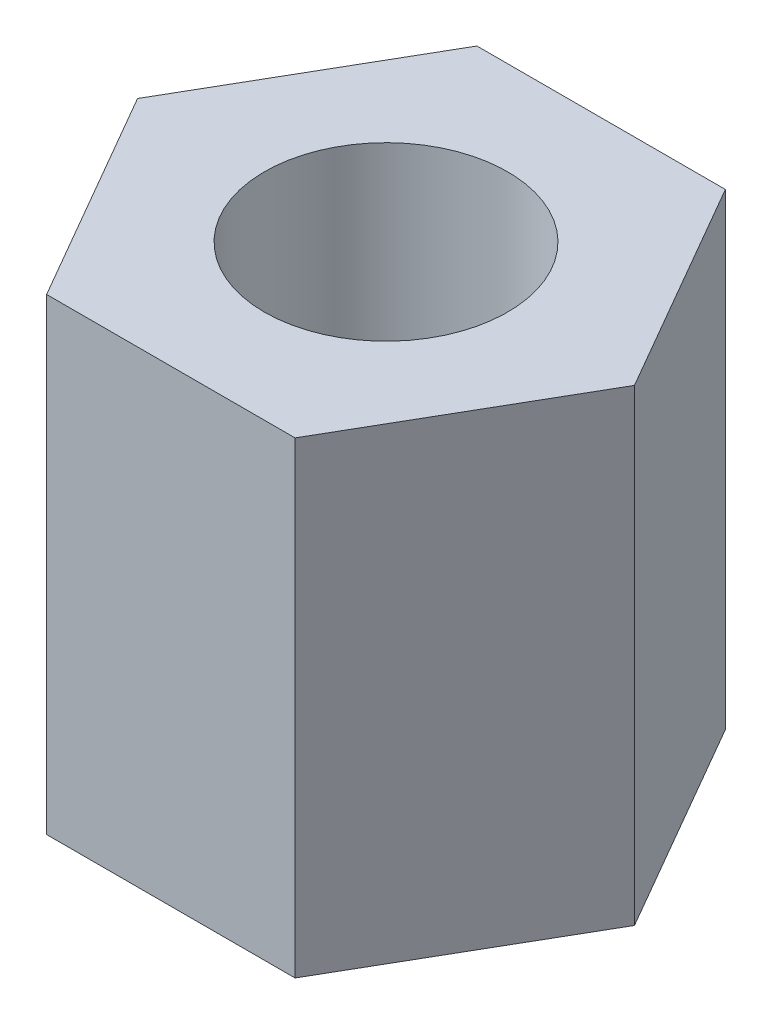
ISO-10303-21;
HEADER;
FILE_DESCRIPTION(('STEP AP214'),'2;1');
FILE_NAME('part.step','',(''),(''),'','','');
FILE_SCHEMA(('AUTOMOTIVE_DESIGN { 1 0 10303 214 1 1 1 1 }'));
ENDSEC;
DATA;
#1=APPLICATION_CONTEXT('core data for automotive mechanical design processes');
#2=APPLICATION_PROTOCOL_DEFINITION('international standard','automotive_design',2000,#1);
#3=PRODUCT_CONTEXT('',#1,'mechanical');
#4=PRODUCT('Part','Part','',(#3));
#5=PRODUCT_RELATED_PRODUCT_CATEGORY('part','',(#4));
#6=PRODUCT_DEFINITION_FORMATION('','',#4);
#7=PRODUCT_DEFINITION_CONTEXT('part definition',#1,'design');
#8=PRODUCT_DEFINITION('design','',#6,#7);
#9=PRODUCT_DEFINITION_SHAPE('','',#8);
#10=(LENGTH_UNIT() NAMED_UNIT(*) SI_UNIT(.MILLI.,.METRE.));
#11=(NAMED_UNIT(*) PLANE_ANGLE_UNIT() SI_UNIT($,.RADIAN.));
#12=(NAMED_UNIT(*) SI_UNIT($,.STERADIAN.) SOLID_ANGLE_UNIT());
#13=UNCERTAINTY_MEASURE_WITH_UNIT(LENGTH_MEASURE(1.E-05),#10,'distance_accuracy_value','');
#14=(GEOMETRIC_REPRESENTATION_CONTEXT(3) GLOBAL_UNCERTAINTY_ASSIGNED_CONTEXT((#13)) GLOBAL_UNIT_ASSIGNED_CONTEXT((#10,
#11,#12)) REPRESENTATION_CONTEXT('',''));
#15=CARTESIAN_POINT('',(0.,0.,0.));
#16=DIRECTION('',(0.,0.,1.));
#17=DIRECTION('',(1.,0.,0.));
#18=AXIS2_PLACEMENT_3D('',#15,#16,#17);
#19=CARTESIAN_POINT('',(0.,5.,0.));
#20=DIRECTION('',(0.,1.,0.));
#21=DIRECTION('',(0.,0.,1.));
#22=AXIS2_PLACEMENT_3D('',#19,#20,#21);
#23=PLANE('',#22);
#24=DIRECTION('',(1.,0.,0.));
#25=VECTOR('',#24,1.);
#26=CARTESIAN_POINT('',(-1.32790561913614,5.,2.3));
#27=LINE('',#26,#25);
#28=CARTESIAN_POINT('',(-1.32790561913614,5.,2.3));
#29=VERTEX_POINT('',#28);
#30=CARTESIAN_POINT('',(1.32790561913614,5.,2.3));
#31=VERTEX_POINT('',#30);
#32=EDGE_CURVE('E134',#29,#31,#27,.T.);
#33=ORIENTED_EDGE('',*,*,#32,.T.);
#34=DIRECTION('',(0.5,0.,-0.866025403784439));
#35=VECTOR('',#34,1.);
#36=CARTESIAN_POINT('',(1.32790561913614,5.,2.3));
#37=LINE('',#36,#35);
#38=CARTESIAN_POINT('',(2.65581123827228,5.,0.));
#39=VERTEX_POINT('',#38);
#40=EDGE_CURVE('E93',#31,#39,#37,.T.);
#41=ORIENTED_EDGE('',*,*,#40,.T.);
#42=DIRECTION('',(-0.5,0.,-0.866025403784438));
#43=VECTOR('',#42,1.);
#44=CARTESIAN_POINT('',(2.65581123827228,5.,0.));
#45=LINE('',#44,#43);
#46=CARTESIAN_POINT('',(1.32790561913614,5.,-2.3));
#47=VERTEX_POINT('',#46);
#48=EDGE_CURVE('E107',#39,#47,#45,.T.);
#49=ORIENTED_EDGE('',*,*,#48,.T.);
#50=DIRECTION('',(-1.,0.,0.));
#51=VECTOR('',#50,1.);
#52=CARTESIAN_POINT('',(1.32790561913614,5.,-2.3));
#53=LINE('',#52,#51);
#54=CARTESIAN_POINT('',(-1.32790561913614,5.,-2.3));
#55=VERTEX_POINT('',#54);
#56=EDGE_CURVE('E99',#47,#55,#53,.T.);
#57=ORIENTED_EDGE('',*,*,#56,.T.);
#58=DIRECTION('',(-0.5,0.,0.866025403784439));
#59=VECTOR('',#58,1.);
#60=CARTESIAN_POINT('',(-1.32790561913614,5.,-2.3));
#61=LINE('',#60,#59);
#62=CARTESIAN_POINT('',(-2.65581123827228,5.,0.));
#63=VERTEX_POINT('',#62);
#64=EDGE_CURVE('E101',#55,#63,#61,.T.);
#65=ORIENTED_EDGE('',*,*,#64,.T.);
#66=DIRECTION('',(0.5,0.,0.866025403784439));
#67=VECTOR('',#66,1.);
#68=CARTESIAN_POINT('',(-2.65581123827228,5.,0.));
#69=LINE('',#68,#67);
#70=EDGE_CURVE('E57',#63,#29,#69,.T.);
#71=ORIENTED_EDGE('',*,*,#70,.T.);
#72=EDGE_LOOP('',(#33,#41,#49,#57,#65,#71));
#73=FACE_BOUND('',#72,.T.);
#74=CARTESIAN_POINT('',(0.,5.,0.));
#75=DIRECTION('',(0.,1.,0.));
#76=DIRECTION('',(0.,0.,1.));
#77=AXIS2_PLACEMENT_3D('',#74,#75,#76);
#78=CIRCLE('',#77,1.3);
#79=CARTESIAN_POINT('',(0.,5.,1.3));
#80=VERTEX_POINT('',#79);
#81=EDGE_CURVE('E126',#80,#80,#78,.T.);
#82=ORIENTED_EDGE('',*,*,#81,.F.);
#83=EDGE_LOOP('',(#82));
#84=FACE_BOUND('',#83,.T.);
#85=ADVANCED_FACE('F39',(#73,#84),#23,.T.);
#86=CARTESIAN_POINT('',(0.,0.,0.));
#87=DIRECTION('',(0.,1.,0.));
#88=DIRECTION('',(0.,0.,1.));
#89=AXIS2_PLACEMENT_3D('',#86,#87,#88);
#90=PLANE('',#89);
#91=DIRECTION('',(1.,0.,0.));
#92=VECTOR('',#91,1.);
#93=CARTESIAN_POINT('',(-1.32790561913614,0.,2.3));
#94=LINE('',#93,#92);
#95=CARTESIAN_POINT('',(-1.32790561913614,0.,2.3));
#96=VERTEX_POINT('',#95);
#97=CARTESIAN_POINT('',(1.32790561913614,0.,2.3));
#98=VERTEX_POINT('',#97);
#99=EDGE_CURVE('E125',#96,#98,#94,.T.);
#100=ORIENTED_EDGE('',*,*,#99,.F.);
#101=DIRECTION('',(0.5,0.,0.866025403784439));
#102=VECTOR('',#101,1.);
#103=CARTESIAN_POINT('',(-2.65581123827228,0.,0.));
#104=LINE('',#103,#102);
#105=CARTESIAN_POINT('',(-2.65581123827228,0.,0.));
#106=VERTEX_POINT('',#105);
#107=EDGE_CURVE('E82',#106,#96,#104,.T.);
#108=ORIENTED_EDGE('',*,*,#107,.F.);
#109=DIRECTION('',(-0.5,0.,0.866025403784439));
#110=VECTOR('',#109,1.);
#111=CARTESIAN_POINT('',(-1.32790561913614,0.,-2.3));
#112=LINE('',#111,#110);
#113=CARTESIAN_POINT('',(-1.32790561913614,0.,-2.3));
#114=VERTEX_POINT('',#113);
#115=EDGE_CURVE('E80',#114,#106,#112,.T.);
#116=ORIENTED_EDGE('',*,*,#115,.F.);
#117=DIRECTION('',(-1.,0.,0.));
#118=VECTOR('',#117,1.);
#119=CARTESIAN_POINT('',(1.32790561913614,0.,-2.3));
#120=LINE('',#119,#118);
#121=CARTESIAN_POINT('',(1.32790561913614,0.,-2.3));
#122=VERTEX_POINT('',#121);
#123=EDGE_CURVE('E114',#122,#114,#120,.T.);
#124=ORIENTED_EDGE('',*,*,#123,.F.);
#125=DIRECTION('',(-0.5,0.,-0.866025403784438));
#126=VECTOR('',#125,1.);
#127=CARTESIAN_POINT('',(2.65581123827228,0.,0.));
#128=LINE('',#127,#126);
#129=CARTESIAN_POINT('',(2.65581123827228,0.,0.));
#130=VERTEX_POINT('',#129);
#131=EDGE_CURVE('E127',#130,#122,#128,.T.);
#132=ORIENTED_EDGE('',*,*,#131,.F.);
#133=DIRECTION('',(0.5,0.,-0.866025403784439));
#134=VECTOR('',#133,1.);
#135=CARTESIAN_POINT('',(1.32790561913614,0.,2.3));
#136=LINE('',#135,#134);
#137=EDGE_CURVE('E130',#98,#130,#136,.T.);
#138=ORIENTED_EDGE('',*,*,#137,.F.);
#139=EDGE_LOOP('',(#100,#108,#116,#124,#132,#138));
#140=FACE_BOUND('',#139,.T.);
#141=CARTESIAN_POINT('',(0.,0.,0.));
#142=DIRECTION('',(0.,1.,0.));
#143=DIRECTION('',(0.,0.,1.));
#144=AXIS2_PLACEMENT_3D('',#141,#142,#143);
#145=CIRCLE('',#144,1.3);
#146=CARTESIAN_POINT('',(0.,0.,1.3));
#147=VERTEX_POINT('',#146);
#148=EDGE_CURVE('E228',#147,#147,#145,.T.);
#149=ORIENTED_EDGE('',*,*,#148,.T.);
#150=EDGE_LOOP('',(#149));
#151=FACE_BOUND('',#150,.T.);
#152=ADVANCED_FACE('F143',(#140,#151),#90,.F.);
#153=CARTESIAN_POINT('',(-1.32790561913614,5.,2.3));
#154=DIRECTION('',(0.,0.,-1.));
#155=DIRECTION('',(-1.,0.,0.));
#156=AXIS2_PLACEMENT_3D('',#153,#154,#155);
#157=PLANE('',#156);
#158=ORIENTED_EDGE('',*,*,#99,.T.);
#159=DIRECTION('',(0.,-1.,0.));
#160=VECTOR('',#159,1.);
#161=CARTESIAN_POINT('',(1.32790561913614,5.,2.3));
#162=LINE('',#161,#160);
#163=EDGE_CURVE('E11',#31,#98,#162,.T.);
#164=ORIENTED_EDGE('',*,*,#163,.F.);
#165=ORIENTED_EDGE('',*,*,#32,.F.);
#166=DIRECTION('',(0.,-1.,0.));
#167=VECTOR('',#166,1.);
#168=CARTESIAN_POINT('',(-1.32790561913614,5.,2.3));
#169=LINE('',#168,#167);
#170=EDGE_CURVE('E118',#29,#96,#169,.T.);
#171=ORIENTED_EDGE('',*,*,#170,.T.);
#172=EDGE_LOOP('',(#158,#164,#165,#171));
#173=FACE_BOUND('',#172,.T.);
#174=ADVANCED_FACE('F41',(#173),#157,.F.);
#175=CARTESIAN_POINT('',(1.32790561913614,5.,2.3));
#176=DIRECTION('',(-0.866025403784439,0.,-0.5));
#177=DIRECTION('',(-0.5,0.,0.866025403784439));
#178=AXIS2_PLACEMENT_3D('',#175,#176,#177);
#179=PLANE('',#178);
#180=ORIENTED_EDGE('',*,*,#137,.T.);
#181=DIRECTION('',(0.,-1.,0.));
#182=VECTOR('',#181,1.);
#183=CARTESIAN_POINT('',(2.65581123827228,5.,0.));
#184=LINE('',#183,#182);
#185=EDGE_CURVE('E48',#39,#130,#184,.T.);
#186=ORIENTED_EDGE('',*,*,#185,.F.);
#187=ORIENTED_EDGE('',*,*,#40,.F.);
#188=ORIENTED_EDGE('',*,*,#163,.T.);
#189=EDGE_LOOP('',(#180,#186,#187,#188));
#190=FACE_BOUND('',#189,.T.);
#191=ADVANCED_FACE('F170',(#190),#179,.F.);
#192=CARTESIAN_POINT('',(2.65581123827228,5.,0.));
#193=DIRECTION('',(-0.866025403784438,0.,0.5));
#194=DIRECTION('',(0.5,0.,0.866025403784439));
#195=AXIS2_PLACEMENT_3D('',#192,#193,#194);
#196=PLANE('',#195);
#197=ORIENTED_EDGE('',*,*,#131,.T.);
#198=DIRECTION('',(0.,-1.,0.));
#199=VECTOR('',#198,1.);
#200=CARTESIAN_POINT('',(1.32790561913614,5.,-2.3));
#201=LINE('',#200,#199);
#202=EDGE_CURVE('E113',#47,#122,#201,.T.);
#203=ORIENTED_EDGE('',*,*,#202,.F.);
#204=ORIENTED_EDGE('',*,*,#48,.F.);
#205=ORIENTED_EDGE('',*,*,#185,.T.);
#206=EDGE_LOOP('',(#197,#203,#204,#205));
#207=FACE_BOUND('',#206,.T.);
#208=ADVANCED_FACE('F141',(#207),#196,.F.);
#209=CARTESIAN_POINT('',(1.32790561913614,5.,-2.3));
#210=DIRECTION('',(0.,0.,1.));
#211=DIRECTION('',(1.,0.,0.));
#212=AXIS2_PLACEMENT_3D('',#209,#210,#211);
#213=PLANE('',#212);
#214=ORIENTED_EDGE('',*,*,#123,.T.);
#215=DIRECTION('',(0.,-1.,0.));
#216=VECTOR('',#215,1.);
#217=CARTESIAN_POINT('',(-1.32790561913614,5.,-2.3));
#218=LINE('',#217,#216);
#219=EDGE_CURVE('E112',#55,#114,#218,.T.);
#220=ORIENTED_EDGE('',*,*,#219,.F.);
#221=ORIENTED_EDGE('',*,*,#56,.F.);
#222=ORIENTED_EDGE('',*,*,#202,.T.);
#223=EDGE_LOOP('',(#214,#220,#221,#222));
#224=FACE_BOUND('',#223,.T.);
#225=ADVANCED_FACE('F115',(#224),#213,.F.);
#226=CARTESIAN_POINT('',(-1.32790561913614,5.,-2.3));
#227=DIRECTION('',(0.866025403784439,0.,0.5));
#228=DIRECTION('',(0.5,0.,-0.866025403784439));
#229=AXIS2_PLACEMENT_3D('',#226,#227,#228);
#230=PLANE('',#229);
#231=ORIENTED_EDGE('',*,*,#115,.T.);
#232=DIRECTION('',(0.,-1.,0.));
#233=VECTOR('',#232,1.);
#234=CARTESIAN_POINT('',(-2.65581123827228,5.,0.));
#235=LINE('',#234,#233);
#236=EDGE_CURVE('E117',#63,#106,#235,.T.);
#237=ORIENTED_EDGE('',*,*,#236,.F.);
#238=ORIENTED_EDGE('',*,*,#64,.F.);
#239=ORIENTED_EDGE('',*,*,#219,.T.);
#240=EDGE_LOOP('',(#231,#237,#238,#239));
#241=FACE_BOUND('',#240,.T.);
#242=ADVANCED_FACE('F120',(#241),#230,.F.);
#243=CARTESIAN_POINT('',(-2.65581123827228,5.,0.));
#244=DIRECTION('',(0.866025403784439,0.,-0.5));
#245=DIRECTION('',(-0.5,0.,-0.866025403784439));
#246=AXIS2_PLACEMENT_3D('',#243,#244,#245);
#247=PLANE('',#246);
#248=ORIENTED_EDGE('',*,*,#107,.T.);
#249=ORIENTED_EDGE('',*,*,#170,.F.);
#250=ORIENTED_EDGE('',*,*,#70,.F.);
#251=ORIENTED_EDGE('',*,*,#236,.T.);
#252=EDGE_LOOP('',(#248,#249,#250,#251));
#253=FACE_BOUND('',#252,.T.);
#254=ADVANCED_FACE('F146',(#253),#247,.F.);
#255=CARTESIAN_POINT('',(0.,5.,0.));
#256=DIRECTION('',(0.,-1.,0.));
#257=DIRECTION('',(0.,0.,-1.));
#258=AXIS2_PLACEMENT_3D('',#255,#256,#257);
#259=CYLINDRICAL_SURFACE('',#258,1.3);
#260=ORIENTED_EDGE('',*,*,#81,.T.);
#261=EDGE_LOOP('',(#260));
#262=FACE_BOUND('',#261,.T.);
#263=ORIENTED_EDGE('',*,*,#148,.F.);
#264=EDGE_LOOP('',(#263));
#265=FACE_BOUND('',#264,.T.);
#266=ADVANCED_FACE('F152',(#262,#265),#259,.F.);
#267=CLOSED_SHELL('',(#85,#152,#174,#191,#208,#225,#242,#254,#266));
#268=MANIFOLD_SOLID_BREP('B2',#267);
#269=ADVANCED_BREP_SHAPE_REPRESENTATION('',(#18,#268),#14);
#270=SHAPE_DEFINITION_REPRESENTATION(#9,#269);
ENDSEC;
END-ISO-10303-21;
